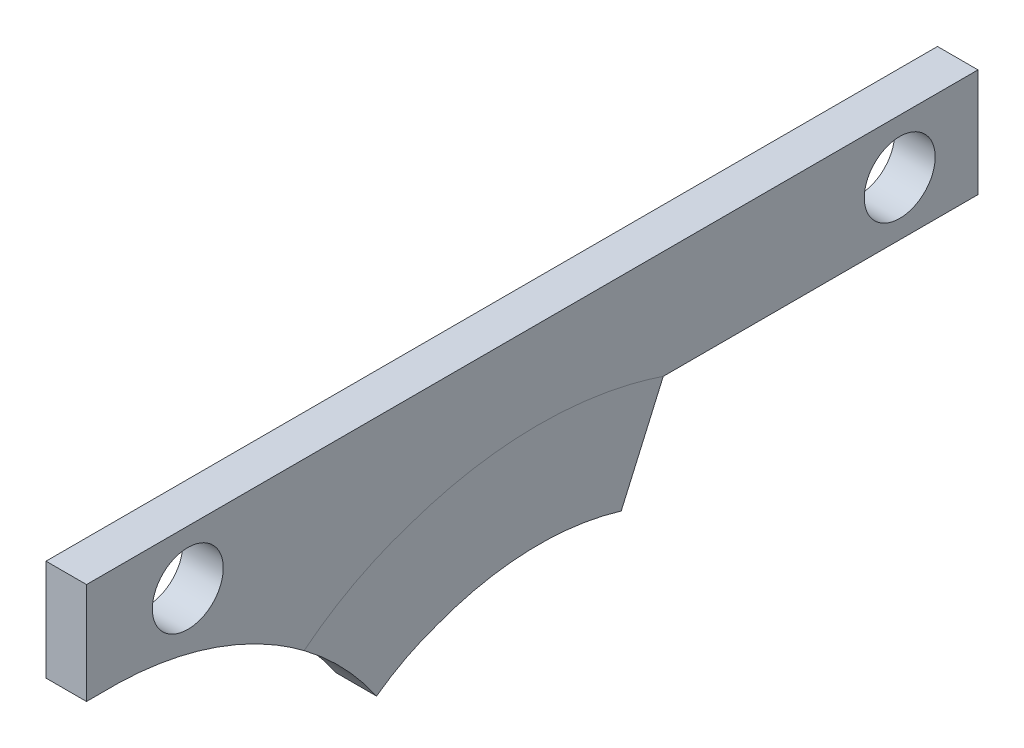
ISO-10303-21;
HEADER;
FILE_DESCRIPTION(('STEP AP214'),'2;1');
FILE_NAME('part.step','',(''),(''),'','','');
FILE_SCHEMA(('AUTOMOTIVE_DESIGN { 1 0 10303 214 1 1 1 1 }'));
ENDSEC;
DATA;
#1=APPLICATION_CONTEXT('core data for automotive mechanical design processes');
#2=APPLICATION_PROTOCOL_DEFINITION('international standard','automotive_design',2000,#1);
#3=PRODUCT_CONTEXT('',#1,'mechanical');
#4=PRODUCT('Part','Part','',(#3));
#5=PRODUCT_RELATED_PRODUCT_CATEGORY('part','',(#4));
#6=PRODUCT_DEFINITION_FORMATION('','',#4);
#7=PRODUCT_DEFINITION_CONTEXT('part definition',#1,'design');
#8=PRODUCT_DEFINITION('design','',#6,#7);
#9=PRODUCT_DEFINITION_SHAPE('','',#8);
#10=(LENGTH_UNIT() NAMED_UNIT(*) SI_UNIT(.MILLI.,.METRE.));
#11=(NAMED_UNIT(*) PLANE_ANGLE_UNIT() SI_UNIT($,.RADIAN.));
#12=(NAMED_UNIT(*) SI_UNIT($,.STERADIAN.) SOLID_ANGLE_UNIT());
#13=UNCERTAINTY_MEASURE_WITH_UNIT(LENGTH_MEASURE(1.E-05),#10,'distance_accuracy_value','');
#14=(GEOMETRIC_REPRESENTATION_CONTEXT(3) GLOBAL_UNCERTAINTY_ASSIGNED_CONTEXT((#13)) GLOBAL_UNIT_ASSIGNED_CONTEXT((#10,
#11,#12)) REPRESENTATION_CONTEXT('',''));
#15=CARTESIAN_POINT('',(0.,0.,0.));
#16=DIRECTION('',(0.,0.,1.));
#17=DIRECTION('',(1.,0.,0.));
#18=AXIS2_PLACEMENT_3D('',#15,#16,#17);
#19=CARTESIAN_POINT('',(-310.5,185.,219.999999999998));
#20=CARTESIAN_POINT('',(-310.5,184.50816695374,204.877009792477));
#21=CARTESIAN_POINT('',(-310.5,175.418459021161,192.780566420039));
#22=CARTESIAN_POINT('',(-316.5,185.,219.999999999998));
#23=CARTESIAN_POINT('',(-316.5,184.50816695374,204.877009792477));
#24=CARTESIAN_POINT('',(-316.5,175.418459021161,192.780566420039));
#25=(BOUNDED_SURFACE() B_SPLINE_SURFACE(1,2,((#19,#20,#21),(#22,#23,#24)),.UNSPECIFIED.,.F.,.F.,
.F.) B_SPLINE_SURFACE_WITH_KNOTS((2,2),(3,3),(0.0626276430115544,0.187882929034663),
(0.0325107499581212,0.644419774946387),
.UNSPECIFIED.) GEOMETRIC_REPRESENTATION_ITEM() RATIONAL_B_SPLINE_SURFACE(((1.,0.953559884501479,
1.),(1.,0.953559884501479,1.))) REPRESENTATION_ITEM('') SURFACE());
#26=CARTESIAN_POINT('',(-310.5,185.,219.999999999998));
#27=CARTESIAN_POINT('',(-316.5,185.,219.999999999998));
#28=(BOUNDED_CURVE() B_SPLINE_CURVE(1,(#26,#27),.UNSPECIFIED.,.F.,
.F.) B_SPLINE_CURVE_WITH_KNOTS((2,2),(-0.1,0.5),
.UNSPECIFIED.) CURVE() GEOMETRIC_REPRESENTATION_ITEM() RATIONAL_B_SPLINE_CURVE((1.,1.)) REPRESENTATION_ITEM(''));
#29=CARTESIAN_POINT('',(-310.5,185.,219.999999999998));
#30=VERTEX_POINT('',#29);
#31=CARTESIAN_POINT('',(-316.5,185.,219.999999999998));
#32=VERTEX_POINT('',#31);
#33=EDGE_CURVE('E12',#30,#32,#28,.T.);
#34=CARTESIAN_POINT('',(-316.5,175.418459021161,192.780566420039));
#35=CARTESIAN_POINT('',(-316.5,184.50816695374,204.877009792477));
#36=CARTESIAN_POINT('',(-316.5,185.,219.999999999998));
#37=(BOUNDED_CURVE() B_SPLINE_CURVE(2,(#34,#35,#36),.UNSPECIFIED.,.F.,
.F.) B_SPLINE_CURVE_WITH_KNOTS((3,3),(-0.644419774946387,-0.0325107499581212),
.UNSPECIFIED.) CURVE() GEOMETRIC_REPRESENTATION_ITEM() RATIONAL_B_SPLINE_CURVE((1.,
0.953559884501481,1.)) REPRESENTATION_ITEM(''));
#38=CARTESIAN_POINT('',(-316.5,175.41845902116,192.780566420039));
#39=VERTEX_POINT('',#38);
#40=EDGE_CURVE('E249',#39,#32,#37,.T.);
#41=CARTESIAN_POINT('',(-310.5,175.418459021161,192.780566420039));
#42=CARTESIAN_POINT('',(-316.5,175.418459021161,192.780566420039));
#43=(BOUNDED_CURVE() B_SPLINE_CURVE(1,(#41,#42),.UNSPECIFIED.,.F.,
.F.) B_SPLINE_CURVE_WITH_KNOTS((2,2),(0.3,0.9),
.UNSPECIFIED.) CURVE() GEOMETRIC_REPRESENTATION_ITEM() RATIONAL_B_SPLINE_CURVE((1.,1.)) REPRESENTATION_ITEM(''));
#44=CARTESIAN_POINT('',(-310.5,175.41845902116,192.780566420039));
#45=VERTEX_POINT('',#44);
#46=EDGE_CURVE('E65',#45,#39,#43,.T.);
#47=CARTESIAN_POINT('',(-310.5,185.,219.999999999998));
#48=CARTESIAN_POINT('',(-310.5,184.50816695374,204.877009792477));
#49=CARTESIAN_POINT('',(-310.5,175.418459021161,192.780566420039));
#50=(BOUNDED_CURVE() B_SPLINE_CURVE(2,(#47,#48,#49),.UNSPECIFIED.,.F.,
.F.) B_SPLINE_CURVE_WITH_KNOTS((3,3),(0.0325107499581212,0.644419774946387),
.UNSPECIFIED.) CURVE() GEOMETRIC_REPRESENTATION_ITEM() RATIONAL_B_SPLINE_CURVE((1.,
0.953559884501481,1.)) REPRESENTATION_ITEM(''));
#51=EDGE_CURVE('E72',#30,#45,#50,.T.);
#52=ORIENTED_EDGE('',*,*,#33,.T.);
#53=ORIENTED_EDGE('',*,*,#40,.F.);
#54=ORIENTED_EDGE('',*,*,#46,.F.);
#55=ORIENTED_EDGE('',*,*,#51,.F.);
#56=EDGE_LOOP('',(#52,#53,#54,#55));
#57=FACE_BOUND('',#56,.T.);
#58=ADVANCED_FACE('F50',(#57),#25,.T.);
#59=CARTESIAN_POINT('',(-316.51,185.,219.989999999998));
#60=CARTESIAN_POINT('',(-316.51,185.,225.009999999998));
#61=CARTESIAN_POINT('',(-310.49,185.,219.989999999998));
#62=CARTESIAN_POINT('',(-310.49,185.,225.009999999998));
#63=(BOUNDED_SURFACE() B_SPLINE_SURFACE(1,1,((#59,#60),(#61,#62)),.UNSPECIFIED.,.F.,.F.,
.F.) B_SPLINE_SURFACE_WITH_KNOTS((2,2),(2,2),(-0.001,0.601),(-0.001,0.501),
.UNSPECIFIED.) GEOMETRIC_REPRESENTATION_ITEM() RATIONAL_B_SPLINE_SURFACE(((1.,1.),(1.,1.))) REPRESENTATION_ITEM('') SURFACE());
#64=CARTESIAN_POINT('',(-316.5,185.,219.999999999998));
#65=CARTESIAN_POINT('',(-316.5,185.,224.999999999998));
#66=(BOUNDED_CURVE() B_SPLINE_CURVE(1,(#64,#65),.UNSPECIFIED.,.F.,
.F.) B_SPLINE_CURVE_WITH_KNOTS((2,2),(0.,0.5),
.UNSPECIFIED.) CURVE() GEOMETRIC_REPRESENTATION_ITEM() RATIONAL_B_SPLINE_CURVE((1.,1.)) REPRESENTATION_ITEM(''));
#67=CARTESIAN_POINT('',(-316.5,185.,224.999999999998));
#68=VERTEX_POINT('',#67);
#69=EDGE_CURVE('E307',#32,#68,#66,.T.);
#70=CARTESIAN_POINT('',(-310.5,185.,219.999999999998));
#71=CARTESIAN_POINT('',(-310.5,185.,224.999999999998));
#72=(BOUNDED_CURVE() B_SPLINE_CURVE(1,(#70,#71),.UNSPECIFIED.,.F.,
.F.) B_SPLINE_CURVE_WITH_KNOTS((2,2),(2.99999999999992,3.49999999999992),
.UNSPECIFIED.) CURVE() GEOMETRIC_REPRESENTATION_ITEM() RATIONAL_B_SPLINE_CURVE((1.,1.)) REPRESENTATION_ITEM(''));
#73=CARTESIAN_POINT('',(-310.5,185.,224.999999999998));
#74=VERTEX_POINT('',#73);
#75=EDGE_CURVE('E283',#30,#74,#72,.T.);
#76=CARTESIAN_POINT('',(-316.5,185.,224.999999999998));
#77=CARTESIAN_POINT('',(-310.5,185.,224.999999999998));
#78=(BOUNDED_CURVE() B_SPLINE_CURVE(1,(#76,#77),.UNSPECIFIED.,.F.,
.F.) B_SPLINE_CURVE_WITH_KNOTS((2,2),(-0.25,0.35),
.UNSPECIFIED.) CURVE() GEOMETRIC_REPRESENTATION_ITEM() RATIONAL_B_SPLINE_CURVE((1.,1.)) REPRESENTATION_ITEM(''));
#79=EDGE_CURVE('E292',#68,#74,#78,.T.);
#80=ORIENTED_EDGE('',*,*,#69,.F.);
#81=ORIENTED_EDGE('',*,*,#33,.F.);
#82=ORIENTED_EDGE('',*,*,#75,.T.);
#83=ORIENTED_EDGE('',*,*,#79,.F.);
#84=EDGE_LOOP('',(#80,#81,#82,#83));
#85=FACE_BOUND('',#84,.T.);
#86=ADVANCED_FACE('F462',(#85),#63,.T.);
#87=CARTESIAN_POINT('',(-310.49,184.99,224.999999999998));
#88=CARTESIAN_POINT('',(-316.51,184.99,224.999999999998));
#89=CARTESIAN_POINT('',(-310.49,200.01,224.999999999998));
#90=CARTESIAN_POINT('',(-316.51,200.01,224.999999999998));
#91=(BOUNDED_SURFACE() B_SPLINE_SURFACE(1,1,((#87,#88),(#89,#90)),.UNSPECIFIED.,.F.,.F.,
.F.) B_SPLINE_SURFACE_WITH_KNOTS((2,2),(2,2),(-0.00100000000000044,1.501),(-0.101,0.501),
.UNSPECIFIED.) GEOMETRIC_REPRESENTATION_ITEM() RATIONAL_B_SPLINE_SURFACE(((1.,1.),(1.,1.))) REPRESENTATION_ITEM('') SURFACE());
#92=CARTESIAN_POINT('',(-310.5,185.,224.999999999998));
#93=CARTESIAN_POINT('',(-310.5,200.,224.999999999998));
#94=(BOUNDED_CURVE() B_SPLINE_CURVE(1,(#92,#93),.UNSPECIFIED.,.F.,
.F.) B_SPLINE_CURVE_WITH_KNOTS((2,2),(2.59999999999992,4.09999999999992),
.UNSPECIFIED.) CURVE() GEOMETRIC_REPRESENTATION_ITEM() RATIONAL_B_SPLINE_CURVE((1.,1.)) REPRESENTATION_ITEM(''));
#95=CARTESIAN_POINT('',(-310.5,200.,224.999999999998));
#96=VERTEX_POINT('',#95);
#97=EDGE_CURVE('E282',#74,#96,#94,.T.);
#98=CARTESIAN_POINT('',(-310.5,200.,224.999999999998));
#99=CARTESIAN_POINT('',(-316.5,200.,224.999999999998));
#100=(BOUNDED_CURVE() B_SPLINE_CURVE(1,(#98,#99),.UNSPECIFIED.,.F.,
.F.) B_SPLINE_CURVE_WITH_KNOTS((2,2),(-0.1,0.5),
.UNSPECIFIED.) CURVE() GEOMETRIC_REPRESENTATION_ITEM() RATIONAL_B_SPLINE_CURVE((1.,1.)) REPRESENTATION_ITEM(''));
#101=CARTESIAN_POINT('',(-316.5,200.,224.999999999998));
#102=VERTEX_POINT('',#101);
#103=EDGE_CURVE('E248',#96,#102,#100,.T.);
#104=CARTESIAN_POINT('',(-316.5,200.,224.999999999998));
#105=CARTESIAN_POINT('',(-316.5,185.,224.999999999998));
#106=(BOUNDED_CURVE() B_SPLINE_CURVE(1,(#104,#105),.UNSPECIFIED.,.F.,
.F.) B_SPLINE_CURVE_WITH_KNOTS((2,2),(-4.09999999999992,-2.59999999999992),
.UNSPECIFIED.) CURVE() GEOMETRIC_REPRESENTATION_ITEM() RATIONAL_B_SPLINE_CURVE((1.,1.)) REPRESENTATION_ITEM(''));
#107=EDGE_CURVE('E239',#102,#68,#106,.T.);
#108=ORIENTED_EDGE('',*,*,#79,.T.);
#109=ORIENTED_EDGE('',*,*,#97,.T.);
#110=ORIENTED_EDGE('',*,*,#103,.T.);
#111=ORIENTED_EDGE('',*,*,#107,.T.);
#112=EDGE_LOOP('',(#108,#109,#110,#111));
#113=FACE_BOUND('',#112,.T.);
#114=ADVANCED_FACE('F467',(#113),#91,.T.);
#115=CARTESIAN_POINT('',(-316.5,175.40845902116,225.009999999998));
#116=CARTESIAN_POINT('',(-316.5,175.40845902116,92.9900013881491));
#117=CARTESIAN_POINT('',(-316.5,200.01,225.009999999998));
#118=CARTESIAN_POINT('',(-316.5,200.01,92.9900013881491));
#119=(BOUNDED_SURFACE() B_SPLINE_SURFACE(1,1,((#115,#116),(#117,#118)),.UNSPECIFIED.,.F.,.F.,
.F.) B_SPLINE_SURFACE_WITH_KNOTS((2,2),(2,2),(4.24084590211586,6.70099999999984),
(-6.50099999999984,6.70099986118509),
.UNSPECIFIED.) GEOMETRIC_REPRESENTATION_ITEM() RATIONAL_B_SPLINE_SURFACE(((1.,1.),(1.,1.))) REPRESENTATION_ITEM('') SURFACE());
#120=CARTESIAN_POINT('',(-316.5,184.000002920505,93.0000013881491));
#121=CARTESIAN_POINT('',(-316.5,184.000002920505,134.029375206115));
#122=CARTESIAN_POINT('',(-316.5,184.000002920505,139.600149064631));
#123=(BOUNDED_CURVE() B_SPLINE_CURVE(1,(#120,#121,#122),.UNSPECIFIED.,.F.,
.F.) B_SPLINE_CURVE_WITH_KNOTS((2,1,2),(-6.30597127861743,-2.20303389682083,-1.64595651096929),
.UNSPECIFIED.) CURVE() GEOMETRIC_REPRESENTATION_ITEM() RATIONAL_B_SPLINE_CURVE((1.,1.,1.)) REPRESENTATION_ITEM(''));
#124=CARTESIAN_POINT('',(-316.5,184.000002920505,93.0000013881491));
#125=VERTEX_POINT('',#124);
#126=CARTESIAN_POINT('',(-316.5,184.000002920505,139.600149064631));
#127=VERTEX_POINT('',#126);
#128=EDGE_CURVE('E91',#125,#127,#123,.T.);
#129=CARTESIAN_POINT('',(-316.5,184.000002920504,139.600149064627));
#130=CARTESIAN_POINT('',(-316.5,190.383345303281,158.469911966903));
#131=CARTESIAN_POINT('',(-316.5,183.73634340119,177.248420365535));
#132=(BOUNDED_CURVE() B_SPLINE_CURVE(2,(#129,#130,#131),.UNSPECIFIED.,.F.,
.F.) B_SPLINE_CURVE_WITH_KNOTS((3,3),(-0.997873568667045,-0.331467968237713),
.UNSPECIFIED.) CURVE() GEOMETRIC_REPRESENTATION_ITEM() RATIONAL_B_SPLINE_CURVE((1.,
0.944999648008286,1.)) REPRESENTATION_ITEM(''));
#133=CARTESIAN_POINT('',(-316.5,183.73634340119,177.248420365535));
#134=VERTEX_POINT('',#133);
#135=EDGE_CURVE('E184',#127,#134,#132,.T.);
#136=CARTESIAN_POINT('',(-316.5,183.73634340119,177.248420365535));
#137=CARTESIAN_POINT('',(-316.5,181.000038118031,185.77635394087));
#138=CARTESIAN_POINT('',(-316.5,175.418459021161,192.780566420039));
#139=(BOUNDED_CURVE() B_SPLINE_CURVE(2,(#136,#137,#138),.UNSPECIFIED.,.F.,
.F.) B_SPLINE_CURVE_WITH_KNOTS((3,3),(-0.390907154968713,-0.0285524358226042),
.UNSPECIFIED.) CURVE() GEOMETRIC_REPRESENTATION_ITEM() RATIONAL_B_SPLINE_CURVE((1.,
0.983632228764737,1.)) REPRESENTATION_ITEM(''));
#140=EDGE_CURVE('E132',#134,#39,#139,.T.);
#141=CARTESIAN_POINT('',(-316.5,200.,93.0000013881491));
#142=CARTESIAN_POINT('',(-316.5,200.,224.999999999998));
#143=(BOUNDED_CURVE() B_SPLINE_CURVE(1,(#141,#142),.UNSPECIFIED.,.F.,
.F.) B_SPLINE_CURVE_WITH_KNOTS((2,2),(-12.6999998611849,0.5),
.UNSPECIFIED.) CURVE() GEOMETRIC_REPRESENTATION_ITEM() RATIONAL_B_SPLINE_CURVE((1.,1.)) REPRESENTATION_ITEM(''));
#144=CARTESIAN_POINT('',(-316.5,200.,93.0000013881491));
#145=VERTEX_POINT('',#144);
#146=EDGE_CURVE('E213',#145,#102,#143,.T.);
#147=CARTESIAN_POINT('',(-316.5,200.,93.0000013881491));
#148=CARTESIAN_POINT('',(-316.5,184.000002920505,93.0000013881491));
#149=(BOUNDED_CURVE() B_SPLINE_CURVE(1,(#147,#148),.UNSPECIFIED.,.F.,
.F.) B_SPLINE_CURVE_WITH_KNOTS((2,2),(-3.69999999999992,-2.10000029205044),
.UNSPECIFIED.) CURVE() GEOMETRIC_REPRESENTATION_ITEM() RATIONAL_B_SPLINE_CURVE((1.,1.)) REPRESENTATION_ITEM(''));
#150=EDGE_CURVE('E322',#145,#125,#149,.T.);
#151=CARTESIAN_POINT('',(-316.5,186.750000000002,104.591492462718));
#152=CARTESIAN_POINT('',(-316.5,186.750000000002,99.3414924627182));
#153=CARTESIAN_POINT('',(-316.5,192.000000000002,99.3414924627182));
#154=CARTESIAN_POINT('',(-316.5,197.250000000002,99.3414924627182));
#155=CARTESIAN_POINT('',(-316.5,197.250000000002,104.591492462718));
#156=CARTESIAN_POINT('',(-316.5,197.250000000002,109.841492462718));
#157=CARTESIAN_POINT('',(-316.5,192.000000000002,109.841492462718));
#158=CARTESIAN_POINT('',(-316.5,186.750000000002,109.841492462718));
#159=CARTESIAN_POINT('',(-316.5,186.750000000002,104.591492462718));
#160=(BOUNDED_CURVE() B_SPLINE_CURVE(2,(#151,#152,#153,#154,#155,#156,#157,#158,#159),
.UNSPECIFIED.,.T.,.F.) B_SPLINE_CURVE_WITH_KNOTS((3,2,2,2,3),(-3.14159265358979,
-1.5707963267949,0.,1.5707963267949,3.14159265358979),
.UNSPECIFIED.) CURVE() GEOMETRIC_REPRESENTATION_ITEM() RATIONAL_B_SPLINE_CURVE((1.,
0.707106781186546,1.,0.707106781186547,1.,0.707106781186547,1.,0.707106781186546,1.)) REPRESENTATION_ITEM(''));
#161=CARTESIAN_POINT('',(-316.5,186.750000000002,104.591492462718));
#162=VERTEX_POINT('',#161);
#163=EDGE_CURVE('E102',#162,#162,#160,.T.);
#164=CARTESIAN_POINT('',(-316.5,186.750000000002,210.));
#165=CARTESIAN_POINT('',(-316.5,186.750000000002,204.75));
#166=CARTESIAN_POINT('',(-316.5,192.000000000002,204.75));
#167=CARTESIAN_POINT('',(-316.5,197.250000000002,204.75));
#168=CARTESIAN_POINT('',(-316.5,197.250000000002,210.));
#169=CARTESIAN_POINT('',(-316.5,197.250000000002,215.25));
#170=CARTESIAN_POINT('',(-316.5,192.000000000002,215.25));
#171=CARTESIAN_POINT('',(-316.5,186.750000000002,215.25));
#172=CARTESIAN_POINT('',(-316.5,186.750000000002,210.));
#173=(BOUNDED_CURVE() B_SPLINE_CURVE(2,(#164,#165,#166,#167,#168,#169,#170,#171,#172),
.UNSPECIFIED.,.T.,.F.) B_SPLINE_CURVE_WITH_KNOTS((3,2,2,2,3),(-3.14159265358979,
-1.5707963267949,0.,1.5707963267949,3.14159265358979),
.UNSPECIFIED.) CURVE() GEOMETRIC_REPRESENTATION_ITEM() RATIONAL_B_SPLINE_CURVE((1.,
0.707106781186547,1.,0.707106781186547,1.,0.707106781186547,1.,0.707106781186547,1.)) REPRESENTATION_ITEM(''));
#174=CARTESIAN_POINT('',(-316.5,186.750000000002,210.));
#175=VERTEX_POINT('',#174);
#176=EDGE_CURVE('E264',#175,#175,#173,.T.);
#177=ORIENTED_EDGE('',*,*,#128,.T.);
#178=ORIENTED_EDGE('',*,*,#135,.T.);
#179=ORIENTED_EDGE('',*,*,#140,.T.);
#180=ORIENTED_EDGE('',*,*,#40,.T.);
#181=ORIENTED_EDGE('',*,*,#69,.T.);
#182=ORIENTED_EDGE('',*,*,#107,.F.);
#183=ORIENTED_EDGE('',*,*,#146,.F.);
#184=ORIENTED_EDGE('',*,*,#150,.T.);
#185=EDGE_LOOP('',(#177,#178,#179,#180,#181,#182,#183,#184));
#186=FACE_BOUND('',#185,.T.);
#187=ORIENTED_EDGE('',*,*,#163,.T.);
#188=EDGE_LOOP('',(#187));
#189=FACE_BOUND('',#188,.T.);
#190=ORIENTED_EDGE('',*,*,#176,.T.);
#191=EDGE_LOOP('',(#190));
#192=FACE_BOUND('',#191,.T.);
#193=ADVANCED_FACE('F491',(#186,#189,#192),#119,.T.);
#194=CARTESIAN_POINT('',(-310.5,200.01,225.009999999998));
#195=CARTESIAN_POINT('',(-310.5,200.01,92.9900013881491));
#196=CARTESIAN_POINT('',(-310.5,175.40845902116,225.009999999998));
#197=CARTESIAN_POINT('',(-310.5,175.40845902116,92.9900013881491));
#198=(BOUNDED_SURFACE() B_SPLINE_SURFACE(1,1,((#194,#195),(#196,#197)),.UNSPECIFIED.,.F.,.F.,
.F.) B_SPLINE_SURFACE_WITH_KNOTS((2,2),(2,2),(4.24084590211586,6.70099999999985),
(-6.50099999999984,6.70099986118509),
.UNSPECIFIED.) GEOMETRIC_REPRESENTATION_ITEM() RATIONAL_B_SPLINE_SURFACE(((1.,1.),(1.,1.))) REPRESENTATION_ITEM('') SURFACE());
#199=CARTESIAN_POINT('',(-310.5,183.736343401191,177.248420365533));
#200=CARTESIAN_POINT('',(-310.5,190.38334530328,158.469911966904));
#201=CARTESIAN_POINT('',(-310.5,184.000002920505,139.600149064631));
#202=(BOUNDED_CURVE() B_SPLINE_CURVE(2,(#199,#200,#201),.UNSPECIFIED.,.F.,
.F.) B_SPLINE_CURVE_WITH_KNOTS((3,3),(0.331467968237757,0.997873568666977),
.UNSPECIFIED.) CURVE() GEOMETRIC_REPRESENTATION_ITEM() RATIONAL_B_SPLINE_CURVE((1.,
0.944999648008311,1.)) REPRESENTATION_ITEM(''));
#203=CARTESIAN_POINT('',(-310.5,183.73634340119,177.248420365535));
#204=VERTEX_POINT('',#203);
#205=CARTESIAN_POINT('',(-310.5,184.000002920505,139.600149064631));
#206=VERTEX_POINT('',#205);
#207=EDGE_CURVE('E347',#204,#206,#202,.T.);
#208=CARTESIAN_POINT('',(-310.5,184.000002920505,139.600149064631));
#209=CARTESIAN_POINT('',(-310.5,184.000002920505,134.029375206116));
#210=CARTESIAN_POINT('',(-310.5,184.000002920505,93.0000013881491));
#211=(BOUNDED_CURVE() B_SPLINE_CURVE(1,(#208,#209,#210),.UNSPECIFIED.,.F.,
.F.) B_SPLINE_CURVE_WITH_KNOTS((2,1,2),(1.64595651096928,2.20303389682073,6.30597127861743),
.UNSPECIFIED.) CURVE() GEOMETRIC_REPRESENTATION_ITEM() RATIONAL_B_SPLINE_CURVE((1.,1.,1.)) REPRESENTATION_ITEM(''));
#212=CARTESIAN_POINT('',(-310.5,184.000002920505,93.0000013881491));
#213=VERTEX_POINT('',#212);
#214=EDGE_CURVE('E273',#206,#213,#211,.T.);
#215=CARTESIAN_POINT('',(-310.5,200.,93.0000013881491));
#216=CARTESIAN_POINT('',(-310.5,184.000002920505,93.0000013881491));
#217=(BOUNDED_CURVE() B_SPLINE_CURVE(1,(#215,#216),.UNSPECIFIED.,.F.,
.F.) B_SPLINE_CURVE_WITH_KNOTS((2,2),(-3.69999999999992,-2.10000029205044),
.UNSPECIFIED.) CURVE() GEOMETRIC_REPRESENTATION_ITEM() RATIONAL_B_SPLINE_CURVE((1.,1.)) REPRESENTATION_ITEM(''));
#218=CARTESIAN_POINT('',(-310.5,200.,93.0000013881491));
#219=VERTEX_POINT('',#218);
#220=EDGE_CURVE('E56',#219,#213,#217,.T.);
#221=CARTESIAN_POINT('',(-310.5,200.,93.0000013881491));
#222=CARTESIAN_POINT('',(-310.5,200.,224.999999999998));
#223=(BOUNDED_CURVE() B_SPLINE_CURVE(1,(#221,#222),.UNSPECIFIED.,.F.,
.F.) B_SPLINE_CURVE_WITH_KNOTS((2,2),(-9.69999986118501,3.49999999999992),
.UNSPECIFIED.) CURVE() GEOMETRIC_REPRESENTATION_ITEM() RATIONAL_B_SPLINE_CURVE((1.,1.)) REPRESENTATION_ITEM(''));
#224=EDGE_CURVE('E238',#219,#96,#223,.T.);
#225=CARTESIAN_POINT('',(-310.5,175.418459021161,192.780566420039));
#226=CARTESIAN_POINT('',(-310.5,181.000038118032,185.776353940869));
#227=CARTESIAN_POINT('',(-310.5,183.736343401191,177.248420365533));
#228=(BOUNDED_CURVE() B_SPLINE_CURVE(2,(#225,#226,#227),.UNSPECIFIED.,.F.,
.F.) B_SPLINE_CURVE_WITH_KNOTS((3,3),(0.0285524358226042,0.390907154968764),
.UNSPECIFIED.) CURVE() GEOMETRIC_REPRESENTATION_ITEM() RATIONAL_B_SPLINE_CURVE((1.,
0.983632228764721,1.)) REPRESENTATION_ITEM(''));
#229=EDGE_CURVE('E338',#45,#204,#228,.T.);
#230=CARTESIAN_POINT('',(-310.5,186.750000000002,210.));
#231=CARTESIAN_POINT('',(-310.5,186.750000000002,215.25));
#232=CARTESIAN_POINT('',(-310.5,192.000000000002,215.25));
#233=CARTESIAN_POINT('',(-310.5,197.250000000002,215.25));
#234=CARTESIAN_POINT('',(-310.5,197.250000000002,210.));
#235=CARTESIAN_POINT('',(-310.5,197.250000000002,204.75));
#236=CARTESIAN_POINT('',(-310.5,192.000000000002,204.75));
#237=CARTESIAN_POINT('',(-310.5,186.750000000002,204.75));
#238=CARTESIAN_POINT('',(-310.5,186.750000000002,210.));
#239=(BOUNDED_CURVE() B_SPLINE_CURVE(2,(#230,#231,#232,#233,#234,#235,#236,#237,#238),
.UNSPECIFIED.,.T.,.F.) B_SPLINE_CURVE_WITH_KNOTS((3,2,2,2,3),(-3.14159265358979,
-1.5707963267949,0.,1.5707963267949,3.14159265358979),
.UNSPECIFIED.) CURVE() GEOMETRIC_REPRESENTATION_ITEM() RATIONAL_B_SPLINE_CURVE((1.,
0.707106781186547,1.,0.707106781186547,1.,0.707106781186547,1.,0.707106781186547,1.)) REPRESENTATION_ITEM(''));
#240=CARTESIAN_POINT('',(-310.5,186.750000000002,210.));
#241=VERTEX_POINT('',#240);
#242=EDGE_CURVE('E229',#241,#241,#239,.T.);
#243=CARTESIAN_POINT('',(-310.5,186.750000000002,104.591492462718));
#244=CARTESIAN_POINT('',(-310.5,186.750000000002,109.841492462718));
#245=CARTESIAN_POINT('',(-310.5,192.000000000002,109.841492462718));
#246=CARTESIAN_POINT('',(-310.5,197.250000000002,109.841492462718));
#247=CARTESIAN_POINT('',(-310.5,197.250000000002,104.591492462718));
#248=CARTESIAN_POINT('',(-310.5,197.250000000002,99.3414924627182));
#249=CARTESIAN_POINT('',(-310.5,192.000000000002,99.3414924627182));
#250=CARTESIAN_POINT('',(-310.5,186.750000000002,99.3414924627182));
#251=CARTESIAN_POINT('',(-310.5,186.750000000002,104.591492462718));
#252=(BOUNDED_CURVE() B_SPLINE_CURVE(2,(#243,#244,#245,#246,#247,#248,#249,#250,#251),
.UNSPECIFIED.,.T.,.F.) B_SPLINE_CURVE_WITH_KNOTS((3,2,2,2,3),(-3.14159265358979,
-1.5707963267949,0.,1.5707963267949,3.14159265358979),
.UNSPECIFIED.) CURVE() GEOMETRIC_REPRESENTATION_ITEM() RATIONAL_B_SPLINE_CURVE((1.,
0.707106781186546,1.,0.707106781186547,1.,0.707106781186547,1.,0.707106781186546,1.)) REPRESENTATION_ITEM(''));
#253=CARTESIAN_POINT('',(-310.5,186.750000000002,104.591492462718));
#254=VERTEX_POINT('',#253);
#255=EDGE_CURVE('E124',#254,#254,#252,.T.);
#256=ORIENTED_EDGE('',*,*,#207,.T.);
#257=ORIENTED_EDGE('',*,*,#214,.T.);
#258=ORIENTED_EDGE('',*,*,#220,.F.);
#259=ORIENTED_EDGE('',*,*,#224,.T.);
#260=ORIENTED_EDGE('',*,*,#97,.F.);
#261=ORIENTED_EDGE('',*,*,#75,.F.);
#262=ORIENTED_EDGE('',*,*,#51,.T.);
#263=ORIENTED_EDGE('',*,*,#229,.T.);
#264=EDGE_LOOP('',(#256,#257,#258,#259,#260,#261,#262,#263));
#265=FACE_BOUND('',#264,.T.);
#266=ORIENTED_EDGE('',*,*,#242,.T.);
#267=EDGE_LOOP('',(#266));
#268=FACE_BOUND('',#267,.T.);
#269=ORIENTED_EDGE('',*,*,#255,.T.);
#270=EDGE_LOOP('',(#269));
#271=FACE_BOUND('',#270,.T.);
#272=ADVANCED_FACE('F442',(#265,#268,#271),#198,.T.);
#273=CARTESIAN_POINT('',(-316.51,184.000002920505,139.600149064631));
#274=CARTESIAN_POINT('',(-310.49,184.000002920505,139.600149064631));
#275=CARTESIAN_POINT('',(-316.51,184.000002920505,134.039375206116));
#276=CARTESIAN_POINT('',(-310.49,184.000002920505,134.039375206116));
#277=CARTESIAN_POINT('',(-316.51,184.000002920505,92.9900013881491));
#278=CARTESIAN_POINT('',(-310.49,184.000002920505,92.9900013881491));
#279=(BOUNDED_SURFACE() B_SPLINE_SURFACE(1,1,((#273,#274),(#275,#276),(#277,#278)),
.UNSPECIFIED.,.F.,.F.,.F.) B_SPLINE_SURFACE_WITH_KNOTS((2,1,2),(2,2),(1.25192792840162,
1.80800531425307,5.91294269604978),(-0.001,0.601),
.UNSPECIFIED.) GEOMETRIC_REPRESENTATION_ITEM() RATIONAL_B_SPLINE_SURFACE(((1.,1.),(1.,1.),(1.,1.))) REPRESENTATION_ITEM('') SURFACE());
#280=CARTESIAN_POINT('',(-310.5,184.000002920505,139.600149064631));
#281=CARTESIAN_POINT('',(-316.5,184.000002920505,139.600149064631));
#282=(BOUNDED_CURVE() B_SPLINE_CURVE(1,(#280,#281),.UNSPECIFIED.,.F.,
.F.) B_SPLINE_CURVE_WITH_KNOTS((2,2),(-0.6,0.),
.UNSPECIFIED.) CURVE() GEOMETRIC_REPRESENTATION_ITEM() RATIONAL_B_SPLINE_CURVE((1.,1.)) REPRESENTATION_ITEM(''));
#283=EDGE_CURVE('E337',#206,#127,#282,.T.);
#284=CARTESIAN_POINT('',(-316.5,184.000002920505,93.0000013881491));
#285=CARTESIAN_POINT('',(-310.5,184.000002920505,93.0000013881491));
#286=(BOUNDED_CURVE() B_SPLINE_CURVE(1,(#284,#285),.UNSPECIFIED.,.F.,
.F.) B_SPLINE_CURVE_WITH_KNOTS((2,2),(-0.125,0.475),
.UNSPECIFIED.) CURVE() GEOMETRIC_REPRESENTATION_ITEM() RATIONAL_B_SPLINE_CURVE((1.,1.)) REPRESENTATION_ITEM(''));
#287=EDGE_CURVE('E381',#125,#213,#286,.T.);
#288=ORIENTED_EDGE('',*,*,#214,.F.);
#289=ORIENTED_EDGE('',*,*,#283,.T.);
#290=ORIENTED_EDGE('',*,*,#128,.F.);
#291=ORIENTED_EDGE('',*,*,#287,.T.);
#292=EDGE_LOOP('',(#288,#289,#290,#291));
#293=FACE_BOUND('',#292,.T.);
#294=ADVANCED_FACE('F454',(#293),#279,.T.);
#295=CARTESIAN_POINT('',(-310.49,200.01,93.0000013881491));
#296=CARTESIAN_POINT('',(-316.51,200.01,93.0000013881491));
#297=CARTESIAN_POINT('',(-310.49,183.990002920505,93.0000013881491));
#298=CARTESIAN_POINT('',(-316.51,183.990002920505,93.0000013881491));
#299=(BOUNDED_SURFACE() B_SPLINE_SURFACE(1,1,((#295,#296),(#297,#298)),.UNSPECIFIED.,.F.,.F.,
.F.) B_SPLINE_SURFACE_WITH_KNOTS((2,2),(2,2),(-0.701,0.900999707949487),(-0.351,0.251),
.UNSPECIFIED.) GEOMETRIC_REPRESENTATION_ITEM() RATIONAL_B_SPLINE_SURFACE(((1.,1.),(1.,1.))) REPRESENTATION_ITEM('') SURFACE());
#300=CARTESIAN_POINT('',(-316.5,200.,93.0000013881491));
#301=CARTESIAN_POINT('',(-310.5,200.,93.0000013881491));
#302=(BOUNDED_CURVE() B_SPLINE_CURVE(1,(#300,#301),.UNSPECIFIED.,.F.,
.F.) B_SPLINE_CURVE_WITH_KNOTS((2,2),(-0.375,0.225),
.UNSPECIFIED.) CURVE() GEOMETRIC_REPRESENTATION_ITEM() RATIONAL_B_SPLINE_CURVE((1.,1.)) REPRESENTATION_ITEM(''));
#303=EDGE_CURVE('E372',#145,#219,#302,.T.);
#304=ORIENTED_EDGE('',*,*,#303,.T.);
#305=ORIENTED_EDGE('',*,*,#220,.T.);
#306=ORIENTED_EDGE('',*,*,#287,.F.);
#307=ORIENTED_EDGE('',*,*,#150,.F.);
#308=EDGE_LOOP('',(#304,#305,#306,#307));
#309=FACE_BOUND('',#308,.T.);
#310=ADVANCED_FACE('F446',(#309),#299,.T.);
#311=CARTESIAN_POINT('',(-310.5,186.750000000002,104.591492462718));
#312=CARTESIAN_POINT('',(-310.5,186.750000000002,109.841492462718));
#313=CARTESIAN_POINT('',(-310.5,192.000000000002,109.841492462718));
#314=CARTESIAN_POINT('',(-310.5,197.250000000002,109.841492462718));
#315=CARTESIAN_POINT('',(-310.5,197.250000000002,104.591492462718));
#316=CARTESIAN_POINT('',(-310.5,197.250000000002,99.3414924627182));
#317=CARTESIAN_POINT('',(-310.5,192.000000000002,99.3414924627182));
#318=CARTESIAN_POINT('',(-310.5,186.750000000002,99.3414924627182));
#319=CARTESIAN_POINT('',(-310.5,186.750000000002,104.591492462718));
#320=CARTESIAN_POINT('',(-316.5,186.750000000002,104.591492462718));
#321=CARTESIAN_POINT('',(-316.5,186.750000000002,109.841492462718));
#322=CARTESIAN_POINT('',(-316.5,192.000000000002,109.841492462718));
#323=CARTESIAN_POINT('',(-316.5,197.250000000002,109.841492462718));
#324=CARTESIAN_POINT('',(-316.5,197.250000000002,104.591492462718));
#325=CARTESIAN_POINT('',(-316.5,197.250000000002,99.3414924627182));
#326=CARTESIAN_POINT('',(-316.5,192.000000000002,99.3414924627182));
#327=CARTESIAN_POINT('',(-316.5,186.750000000002,99.3414924627182));
#328=CARTESIAN_POINT('',(-316.5,186.750000000002,104.591492462718));
#329=(BOUNDED_SURFACE() B_SPLINE_SURFACE(1,2,((#311,#312,#313,#314,#315,#316,#317,#318,#319),
(#320,#321,#322,#323,#324,#325,#326,#327,#328)),.UNSPECIFIED.,.F.,.T.,
.F.) B_SPLINE_SURFACE_WITH_KNOTS((2,2),(3,2,2,2,3),(23.6666666666667,25.),(-3.14159265358979,
-1.5707963267949,0.,1.5707963267949,3.14159265358979),
.UNSPECIFIED.) GEOMETRIC_REPRESENTATION_ITEM() RATIONAL_B_SPLINE_SURFACE(((1.,0.707106781186548,
1.,0.707106781186548,1.,0.707106781186548,1.,0.707106781186548,1.),(1.,0.707106781186548,1.,
0.707106781186548,1.,0.707106781186548,1.,0.707106781186548,1.))) REPRESENTATION_ITEM('') SURFACE());
#330=CARTESIAN_POINT('',(-310.5,186.750000000002,104.591492462718));
#331=CARTESIAN_POINT('',(-316.5,186.750000000002,104.591492462718));
#332=(BOUNDED_CURVE() B_SPLINE_CURVE(1,(#330,#331),.UNSPECIFIED.,.F.,
.F.) B_SPLINE_CURVE_WITH_KNOTS((2,2),(23.6666666666667,25.),
.UNSPECIFIED.) CURVE() GEOMETRIC_REPRESENTATION_ITEM() RATIONAL_B_SPLINE_CURVE((1.,1.)) REPRESENTATION_ITEM(''));
#333=EDGE_CURVE('E228',#254,#162,#332,.T.);
#334=ORIENTED_EDGE('',*,*,#255,.F.);
#335=ORIENTED_EDGE('',*,*,#333,.T.);
#336=ORIENTED_EDGE('',*,*,#163,.F.);
#337=ORIENTED_EDGE('',*,*,#333,.F.);
#338=EDGE_LOOP('',(#334,#335,#336,#337));
#339=FACE_BOUND('',#338,.T.);
#340=ADVANCED_FACE('F443',(#339),#329,.T.);
#341=CARTESIAN_POINT('',(-310.5,186.750000000002,210.));
#342=CARTESIAN_POINT('',(-310.5,186.750000000002,215.25));
#343=CARTESIAN_POINT('',(-310.5,192.000000000002,215.25));
#344=CARTESIAN_POINT('',(-310.5,197.250000000002,215.25));
#345=CARTESIAN_POINT('',(-310.5,197.250000000002,210.));
#346=CARTESIAN_POINT('',(-310.5,197.250000000002,204.75));
#347=CARTESIAN_POINT('',(-310.5,192.000000000002,204.75));
#348=CARTESIAN_POINT('',(-310.5,186.750000000002,204.75));
#349=CARTESIAN_POINT('',(-310.5,186.750000000002,210.));
#350=CARTESIAN_POINT('',(-316.5,186.750000000002,210.));
#351=CARTESIAN_POINT('',(-316.5,186.750000000002,215.25));
#352=CARTESIAN_POINT('',(-316.5,192.000000000002,215.25));
#353=CARTESIAN_POINT('',(-316.5,197.250000000002,215.25));
#354=CARTESIAN_POINT('',(-316.5,197.250000000002,210.));
#355=CARTESIAN_POINT('',(-316.5,197.250000000002,204.75));
#356=CARTESIAN_POINT('',(-316.5,192.000000000002,204.75));
#357=CARTESIAN_POINT('',(-316.5,186.750000000002,204.75));
#358=CARTESIAN_POINT('',(-316.5,186.750000000002,210.));
#359=(BOUNDED_SURFACE() B_SPLINE_SURFACE(1,2,((#341,#342,#343,#344,#345,#346,#347,#348,#349),
(#350,#351,#352,#353,#354,#355,#356,#357,#358)),.UNSPECIFIED.,.F.,.T.,
.F.) B_SPLINE_SURFACE_WITH_KNOTS((2,2),(3,2,2,2,3),(23.6666666666667,25.),(-3.14159265358979,
-1.5707963267949,0.,1.5707963267949,3.14159265358979),
.UNSPECIFIED.) GEOMETRIC_REPRESENTATION_ITEM() RATIONAL_B_SPLINE_SURFACE(((1.,0.707106781186548,
1.,0.707106781186548,1.,0.707106781186548,1.,0.707106781186548,1.),(1.,0.707106781186548,1.,
0.707106781186548,1.,0.707106781186548,1.,0.707106781186548,1.))) REPRESENTATION_ITEM('') SURFACE());
#360=CARTESIAN_POINT('',(-310.5,186.750000000002,210.));
#361=CARTESIAN_POINT('',(-316.5,186.750000000002,210.));
#362=(BOUNDED_CURVE() B_SPLINE_CURVE(1,(#360,#361),.UNSPECIFIED.,.F.,
.F.) B_SPLINE_CURVE_WITH_KNOTS((2,2),(23.6666666666667,25.),
.UNSPECIFIED.) CURVE() GEOMETRIC_REPRESENTATION_ITEM() RATIONAL_B_SPLINE_CURVE((1.,1.)) REPRESENTATION_ITEM(''));
#363=EDGE_CURVE('E219',#241,#175,#362,.T.);
#364=ORIENTED_EDGE('',*,*,#242,.F.);
#365=ORIENTED_EDGE('',*,*,#363,.T.);
#366=ORIENTED_EDGE('',*,*,#176,.F.);
#367=ORIENTED_EDGE('',*,*,#363,.F.);
#368=EDGE_LOOP('',(#364,#365,#366,#367));
#369=FACE_BOUND('',#368,.T.);
#370=ADVANCED_FACE('F445',(#369),#359,.T.);
#371=CARTESIAN_POINT('',(-310.49,200.,225.009999999998));
#372=CARTESIAN_POINT('',(-316.51,200.,225.009999999998));
#373=CARTESIAN_POINT('',(-310.49,200.,92.9900013881491));
#374=CARTESIAN_POINT('',(-316.51,200.,92.9900013881491));
#375=(BOUNDED_SURFACE() B_SPLINE_SURFACE(1,1,((#371,#372),(#373,#374)),.UNSPECIFIED.,.F.,.F.,
.F.) B_SPLINE_SURFACE_WITH_KNOTS((2,2),(2,2),(-0.501,12.7009998611849),(-0.101,0.501),
.UNSPECIFIED.) GEOMETRIC_REPRESENTATION_ITEM() RATIONAL_B_SPLINE_SURFACE(((1.,1.),(1.,1.))) REPRESENTATION_ITEM('') SURFACE());
#376=ORIENTED_EDGE('',*,*,#224,.F.);
#377=ORIENTED_EDGE('',*,*,#303,.F.);
#378=ORIENTED_EDGE('',*,*,#146,.T.);
#379=ORIENTED_EDGE('',*,*,#103,.F.);
#380=EDGE_LOOP('',(#376,#377,#378,#379));
#381=FACE_BOUND('',#380,.T.);
#382=ADVANCED_FACE('F52',(#381),#375,.T.);
#383=CARTESIAN_POINT('',(-316.5,129.480034944395,158.043392050344));
#384=DIRECTION('',(-1.,0.,0.));
#385=DIRECTION('',(0.,0.,1.));
#386=AXIS2_PLACEMENT_3D('',#383,#384,#385);
#387=PLANE('',#386);
#388=CARTESIAN_POINT('',(-316.5,137.123142878134,221.55706114733));
#389=DIRECTION('',(-1.,0.,0.));
#390=DIRECTION('',(0.,0.,-1.));
#391=AXIS2_PLACEMENT_3D('',#388,#389,#390);
#392=CIRCLE('',#391,47.9021699642522);
#393=CARTESIAN_POINT('',(-316.5,164.223212785385,182.057642185701));
#394=VERTEX_POINT('',#393);
#395=EDGE_CURVE('E186',#39,#394,#392,.T.);
#396=ORIENTED_EDGE('',*,*,#395,.F.);
#397=ORIENTED_EDGE('',*,*,#140,.F.);
#398=ORIENTED_EDGE('',*,*,#135,.F.);
#399=DIRECTION('',(0.,0.915294684400777,-0.402784856601738));
#400=VECTOR('',#399,1.);
#401=CARTESIAN_POINT('',(-316.5,169.843768874797,145.829745715084));
#402=LINE('',#401,#400);
#403=CARTESIAN_POINT('',(-316.5,169.843768874797,145.829745715084));
#404=VERTEX_POINT('',#403);
#405=EDGE_CURVE('E168',#404,#127,#402,.T.);
#406=ORIENTED_EDGE('',*,*,#405,.F.);
#407=CARTESIAN_POINT('',(-316.5,129.480034944395,158.043392050344));
#408=DIRECTION('',(-1.,0.,0.));
#409=DIRECTION('',(0.,0.,1.));
#410=AXIS2_PLACEMENT_3D('',#407,#408,#409);
#411=CIRCLE('',#410,42.171129622137);
#412=CARTESIAN_POINT('',(-316.5,168.945669865423,172.905014905445));
#413=VERTEX_POINT('',#412);
#414=EDGE_CURVE('E182',#413,#404,#411,.T.);
#415=ORIENTED_EDGE('',*,*,#414,.F.);
#416=CARTESIAN_POINT('',(-316.5,137.182964532377,162.311125718204));
#417=DIRECTION('',(-1.,0.,0.));
#418=DIRECTION('',(0.,0.,-1.));
#419=AXIS2_PLACEMENT_3D('',#416,#417,#418);
#420=CIRCLE('',#419,33.4828304984127);
#421=EDGE_CURVE('E177',#394,#413,#420,.T.);
#422=ORIENTED_EDGE('',*,*,#421,.F.);
#423=EDGE_LOOP('',(#396,#397,#398,#406,#415,#422));
#424=FACE_BOUND('',#423,.T.);
#425=ADVANCED_FACE('F180',(#424),#387,.T.);
#426=CARTESIAN_POINT('',(-310.5,129.480034944395,158.043392050344));
#427=DIRECTION('',(-1.,0.,0.));
#428=DIRECTION('',(0.,0.,1.));
#429=AXIS2_PLACEMENT_3D('',#426,#427,#428);
#430=PLANE('',#429);
#431=ORIENTED_EDGE('',*,*,#229,.F.);
#432=CARTESIAN_POINT('',(-310.5,137.123142878134,221.55706114733));
#433=DIRECTION('',(-1.,0.,0.));
#434=DIRECTION('',(0.,0.,-1.));
#435=AXIS2_PLACEMENT_3D('',#432,#433,#434);
#436=CIRCLE('',#435,47.9021699642522);
#437=CARTESIAN_POINT('',(-310.5,164.223212785385,182.057642185701));
#438=VERTEX_POINT('',#437);
#439=EDGE_CURVE('E197',#45,#438,#436,.T.);
#440=ORIENTED_EDGE('',*,*,#439,.T.);
#441=CARTESIAN_POINT('',(-310.5,137.182964532377,162.311125718204));
#442=DIRECTION('',(-1.,0.,0.));
#443=DIRECTION('',(0.,0.,-1.));
#444=AXIS2_PLACEMENT_3D('',#441,#442,#443);
#445=CIRCLE('',#444,33.4828304984127);
#446=CARTESIAN_POINT('',(-310.5,168.945669865423,172.905014905445));
#447=VERTEX_POINT('',#446);
#448=EDGE_CURVE('E191',#438,#447,#445,.T.);
#449=ORIENTED_EDGE('',*,*,#448,.T.);
#450=CARTESIAN_POINT('',(-310.5,129.480034944395,158.043392050344));
#451=DIRECTION('',(-1.,0.,0.));
#452=DIRECTION('',(0.,0.,1.));
#453=AXIS2_PLACEMENT_3D('',#450,#451,#452);
#454=CIRCLE('',#453,42.171129622137);
#455=CARTESIAN_POINT('',(-310.5,169.843768874797,145.829745715084));
#456=VERTEX_POINT('',#455);
#457=EDGE_CURVE('E204',#447,#456,#454,.T.);
#458=ORIENTED_EDGE('',*,*,#457,.T.);
#459=DIRECTION('',(0.,0.915294684400777,-0.402784856601738));
#460=VECTOR('',#459,1.);
#461=CARTESIAN_POINT('',(-310.5,169.843768874797,145.829745715084));
#462=LINE('',#461,#460);
#463=EDGE_CURVE('E170',#456,#206,#462,.T.);
#464=ORIENTED_EDGE('',*,*,#463,.T.);
#465=ORIENTED_EDGE('',*,*,#207,.F.);
#466=EDGE_LOOP('',(#431,#440,#449,#458,#464,#465));
#467=FACE_BOUND('',#466,.T.);
#468=ADVANCED_FACE('F525',(#467),#430,.F.);
#469=CARTESIAN_POINT('',(-316.5,129.480034944395,158.043392050344));
#470=DIRECTION('',(1.,0.,0.));
#471=DIRECTION('',(0.,0.,-1.));
#472=AXIS2_PLACEMENT_3D('',#469,#470,#471);
#473=CYLINDRICAL_SURFACE('',#472,42.171129622137);
#474=ORIENTED_EDGE('',*,*,#457,.F.);
#475=DIRECTION('',(1.,0.,0.));
#476=VECTOR('',#475,1.);
#477=CARTESIAN_POINT('',(-316.5,168.945669865423,172.905014905445));
#478=LINE('',#477,#476);
#479=EDGE_CURVE('E189',#413,#447,#478,.T.);
#480=ORIENTED_EDGE('',*,*,#479,.F.);
#481=ORIENTED_EDGE('',*,*,#414,.T.);
#482=DIRECTION('',(1.,0.,0.));
#483=VECTOR('',#482,1.);
#484=CARTESIAN_POINT('',(-316.5,169.843768874797,145.829745715084));
#485=LINE('',#484,#483);
#486=EDGE_CURVE('E164',#404,#456,#485,.T.);
#487=ORIENTED_EDGE('',*,*,#486,.T.);
#488=EDGE_LOOP('',(#474,#480,#481,#487));
#489=FACE_BOUND('',#488,.T.);
#490=ADVANCED_FACE('F188',(#489),#473,.F.);
#491=CARTESIAN_POINT('',(-316.5,137.182964532377,162.311125718204));
#492=DIRECTION('',(1.,0.,0.));
#493=DIRECTION('',(0.,0.,-1.));
#494=AXIS2_PLACEMENT_3D('',#491,#492,#493);
#495=CYLINDRICAL_SURFACE('',#494,33.4828304984127);
#496=ORIENTED_EDGE('',*,*,#448,.F.);
#497=DIRECTION('',(1.,0.,0.));
#498=VECTOR('',#497,1.);
#499=CARTESIAN_POINT('',(-316.5,164.223212785385,182.057642185701));
#500=LINE('',#499,#498);
#501=EDGE_CURVE('E176',#394,#438,#500,.T.);
#502=ORIENTED_EDGE('',*,*,#501,.F.);
#503=ORIENTED_EDGE('',*,*,#421,.T.);
#504=ORIENTED_EDGE('',*,*,#479,.T.);
#505=EDGE_LOOP('',(#496,#502,#503,#504));
#506=FACE_BOUND('',#505,.T.);
#507=ADVANCED_FACE('F662',(#506),#495,.F.);
#508=CARTESIAN_POINT('',(-316.5,137.123142878134,221.55706114733));
#509=DIRECTION('',(1.,0.,0.));
#510=DIRECTION('',(0.,0.,-1.));
#511=AXIS2_PLACEMENT_3D('',#508,#509,#510);
#512=CYLINDRICAL_SURFACE('',#511,47.9021699642522);
#513=ORIENTED_EDGE('',*,*,#439,.F.);
#514=ORIENTED_EDGE('',*,*,#46,.T.);
#515=ORIENTED_EDGE('',*,*,#395,.T.);
#516=ORIENTED_EDGE('',*,*,#501,.T.);
#517=EDGE_LOOP('',(#513,#514,#515,#516));
#518=FACE_BOUND('',#517,.T.);
#519=ADVANCED_FACE('F670',(#518),#512,.F.);
#520=CARTESIAN_POINT('',(-316.5,169.843768874797,145.829745715084));
#521=DIRECTION('',(0.,-0.402784856601738,-0.915294684400777));
#522=DIRECTION('',(0.,0.915294684400777,-0.402784856601738));
#523=AXIS2_PLACEMENT_3D('',#520,#521,#522);
#524=PLANE('',#523);
#525=ORIENTED_EDGE('',*,*,#405,.T.);
#526=ORIENTED_EDGE('',*,*,#283,.F.);
#527=ORIENTED_EDGE('',*,*,#463,.F.);
#528=ORIENTED_EDGE('',*,*,#486,.F.);
#529=EDGE_LOOP('',(#525,#526,#527,#528));
#530=FACE_BOUND('',#529,.T.);
#531=ADVANCED_FACE('F166',(#530),#524,.T.);
#532=CLOSED_SHELL('',(#58,#86,#114,#193,#272,#294,#310,#340,#370,#382,#425,#468,#490,#507,#519,#531));
#533=MANIFOLD_SOLID_BREP('B2',#532);
#534=ADVANCED_BREP_SHAPE_REPRESENTATION('',(#18,#533),#14);
#535=SHAPE_DEFINITION_REPRESENTATION(#9,#534);
ENDSEC;
END-ISO-10303-21;
